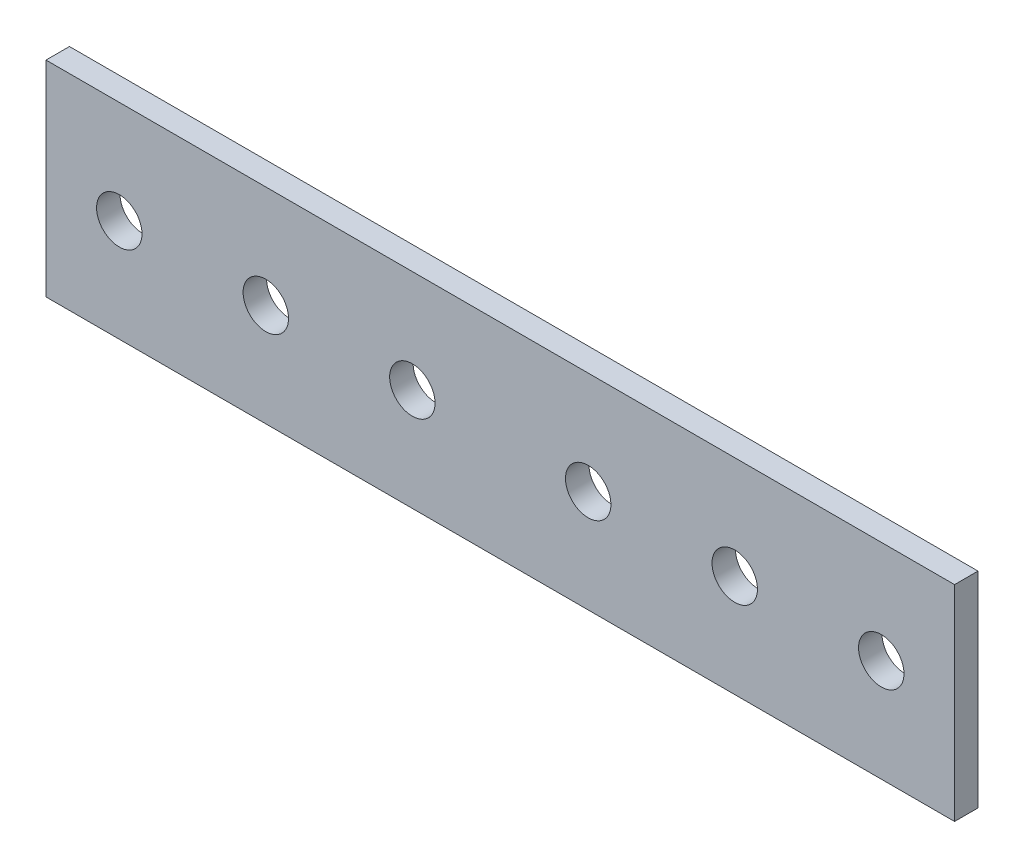
ISO-10303-21;
HEADER;
FILE_DESCRIPTION(('STEP AP214'),'2;1');
FILE_NAME('part.step','',(''),(''),'','','');
FILE_SCHEMA(('AUTOMOTIVE_DESIGN { 1 0 10303 214 1 1 1 1 }'));
ENDSEC;
DATA;
#1=APPLICATION_CONTEXT('core data for automotive mechanical design processes');
#2=APPLICATION_PROTOCOL_DEFINITION('international standard','automotive_design',2000,#1);
#3=PRODUCT_CONTEXT('',#1,'mechanical');
#4=PRODUCT('Part','Part','',(#3));
#5=PRODUCT_RELATED_PRODUCT_CATEGORY('part','',(#4));
#6=PRODUCT_DEFINITION_FORMATION('','',#4);
#7=PRODUCT_DEFINITION_CONTEXT('part definition',#1,'design');
#8=PRODUCT_DEFINITION('design','',#6,#7);
#9=PRODUCT_DEFINITION_SHAPE('','',#8);
#10=(LENGTH_UNIT() NAMED_UNIT(*) SI_UNIT(.MILLI.,.METRE.));
#11=(NAMED_UNIT(*) PLANE_ANGLE_UNIT() SI_UNIT($,.RADIAN.));
#12=(NAMED_UNIT(*) SI_UNIT($,.STERADIAN.) SOLID_ANGLE_UNIT());
#13=UNCERTAINTY_MEASURE_WITH_UNIT(LENGTH_MEASURE(1.E-05),#10,'distance_accuracy_value','');
#14=(GEOMETRIC_REPRESENTATION_CONTEXT(3) GLOBAL_UNCERTAINTY_ASSIGNED_CONTEXT((#13)) GLOBAL_UNIT_ASSIGNED_CONTEXT((#10,
#11,#12)) REPRESENTATION_CONTEXT('',''));
#15=CARTESIAN_POINT('',(0.,0.,0.));
#16=DIRECTION('',(0.,0.,1.));
#17=DIRECTION('',(1.,0.,0.));
#18=AXIS2_PLACEMENT_3D('',#15,#16,#17);
#19=CARTESIAN_POINT('',(-44.9092942055939,-15.9781588447653,16.));
#20=DIRECTION('',(0.,0.,1.));
#21=DIRECTION('',(1.,0.,0.));
#22=AXIS2_PLACEMENT_3D('',#19,#20,#21);
#23=PLANE('',#22);
#24=CARTESIAN_POINT('',(325.090705794406,54.0218411552347,16.));
#25=DIRECTION('',(0.,0.,1.));
#26=DIRECTION('',(-1.,0.,0.));
#27=AXIS2_PLACEMENT_3D('',#24,#25,#26);
#28=CIRCLE('',#27,15.5);
#29=CARTESIAN_POINT('',(309.590705794406,54.0218411552347,16.));
#30=VERTEX_POINT('',#29);
#31=EDGE_CURVE('E130',#30,#30,#28,.T.);
#32=ORIENTED_EDGE('',*,*,#31,.F.);
#33=EDGE_LOOP('',(#32));
#34=FACE_BOUND('',#33,.T.);
#35=CARTESIAN_POINT('',(105.090705794406,54.0218411552347,16.));
#36=DIRECTION('',(0.,0.,1.));
#37=DIRECTION('',(1.,0.,0.));
#38=AXIS2_PLACEMENT_3D('',#35,#36,#37);
#39=CIRCLE('',#38,15.5);
#40=CARTESIAN_POINT('',(120.590705794406,54.0218411552347,16.));
#41=VERTEX_POINT('',#40);
#42=EDGE_CURVE('E118',#41,#41,#39,.T.);
#43=ORIENTED_EDGE('',*,*,#42,.F.);
#44=EDGE_LOOP('',(#43));
#45=FACE_BOUND('',#44,.T.);
#46=CARTESIAN_POINT('',(5.09070579440612,54.0218411552347,16.));
#47=DIRECTION('',(0.,0.,1.));
#48=DIRECTION('',(1.,0.,0.));
#49=AXIS2_PLACEMENT_3D('',#46,#47,#48);
#50=CIRCLE('',#49,15.5);
#51=CARTESIAN_POINT('',(20.5907057944061,54.0218411552347,16.));
#52=VERTEX_POINT('',#51);
#53=EDGE_CURVE('E97',#52,#52,#50,.T.);
#54=ORIENTED_EDGE('',*,*,#53,.F.);
#55=EDGE_LOOP('',(#54));
#56=FACE_BOUND('',#55,.T.);
#57=DIRECTION('',(0.,-1.,0.));
#58=VECTOR('',#57,1.);
#59=CARTESIAN_POINT('',(-44.9092942055939,124.021841155235,16.));
#60=LINE('',#59,#58);
#61=CARTESIAN_POINT('',(-44.9092942055939,124.021841155235,16.));
#62=VERTEX_POINT('',#61);
#63=CARTESIAN_POINT('',(-44.9092942055939,-15.9781588447653,16.));
#64=VERTEX_POINT('',#63);
#65=EDGE_CURVE('E82',#62,#64,#60,.T.);
#66=ORIENTED_EDGE('',*,*,#65,.T.);
#67=DIRECTION('',(1.,0.,0.));
#68=VECTOR('',#67,1.);
#69=CARTESIAN_POINT('',(-44.9092942055939,-15.9781588447653,16.));
#70=LINE('',#69,#68);
#71=CARTESIAN_POINT('',(575.090705794406,-15.9781588447653,16.));
#72=VERTEX_POINT('',#71);
#73=EDGE_CURVE('E77',#64,#72,#70,.T.);
#74=ORIENTED_EDGE('',*,*,#73,.T.);
#75=DIRECTION('',(0.,1.,0.));
#76=VECTOR('',#75,1.);
#77=CARTESIAN_POINT('',(575.090705794406,124.021841155235,16.));
#78=LINE('',#77,#76);
#79=CARTESIAN_POINT('',(575.090705794406,124.021841155235,16.));
#80=VERTEX_POINT('',#79);
#81=EDGE_CURVE('E80',#72,#80,#78,.T.);
#82=ORIENTED_EDGE('',*,*,#81,.T.);
#83=DIRECTION('',(-1.,0.,0.));
#84=VECTOR('',#83,1.);
#85=CARTESIAN_POINT('',(-44.9092942055939,124.021841155235,16.));
#86=LINE('',#85,#84);
#87=EDGE_CURVE('E47',#80,#62,#86,.T.);
#88=ORIENTED_EDGE('',*,*,#87,.T.);
#89=EDGE_LOOP('',(#66,#74,#82,#88));
#90=FACE_BOUND('',#89,.T.);
#91=CARTESIAN_POINT('',(205.090705794406,54.0218411552347,16.));
#92=DIRECTION('',(0.,0.,1.));
#93=DIRECTION('',(1.,0.,0.));
#94=AXIS2_PLACEMENT_3D('',#91,#92,#93);
#95=CIRCLE('',#94,15.5);
#96=CARTESIAN_POINT('',(220.590705794406,54.0218411552347,16.));
#97=VERTEX_POINT('',#96);
#98=EDGE_CURVE('E112',#97,#97,#95,.T.);
#99=ORIENTED_EDGE('',*,*,#98,.F.);
#100=EDGE_LOOP('',(#99));
#101=FACE_BOUND('',#100,.T.);
#102=CARTESIAN_POINT('',(425.090705794406,54.0218411552347,16.));
#103=DIRECTION('',(0.,0.,1.));
#104=DIRECTION('',(-1.,0.,0.));
#105=AXIS2_PLACEMENT_3D('',#102,#103,#104);
#106=CIRCLE('',#105,15.5);
#107=CARTESIAN_POINT('',(409.590705794406,54.0218411552347,16.));
#108=VERTEX_POINT('',#107);
#109=EDGE_CURVE('E124',#108,#108,#106,.T.);
#110=ORIENTED_EDGE('',*,*,#109,.F.);
#111=EDGE_LOOP('',(#110));
#112=FACE_BOUND('',#111,.T.);
#113=CARTESIAN_POINT('',(525.090705794406,54.0218411552347,16.));
#114=DIRECTION('',(0.,0.,1.));
#115=DIRECTION('',(-1.,0.,0.));
#116=AXIS2_PLACEMENT_3D('',#113,#114,#115);
#117=CIRCLE('',#116,15.4999999999999);
#118=CARTESIAN_POINT('',(509.590705794406,54.0218411552347,16.));
#119=VERTEX_POINT('',#118);
#120=EDGE_CURVE('E136',#119,#119,#117,.T.);
#121=ORIENTED_EDGE('',*,*,#120,.F.);
#122=EDGE_LOOP('',(#121));
#123=FACE_BOUND('',#122,.T.);
#124=ADVANCED_FACE('F30',(#34,#45,#56,#90,#101,#112,#123),#23,.T.);
#125=CARTESIAN_POINT('',(-44.9092942055939,-15.9781588447653,0.));
#126=DIRECTION('',(0.,0.,1.));
#127=DIRECTION('',(1.,0.,0.));
#128=AXIS2_PLACEMENT_3D('',#125,#126,#127);
#129=PLANE('',#128);
#130=CARTESIAN_POINT('',(325.090705794406,54.0218411552347,0.));
#131=DIRECTION('',(0.,0.,1.));
#132=DIRECTION('',(-1.,0.,0.));
#133=AXIS2_PLACEMENT_3D('',#130,#131,#132);
#134=CIRCLE('',#133,15.5);
#135=CARTESIAN_POINT('',(309.590705794406,54.0218411552347,0.));
#136=VERTEX_POINT('',#135);
#137=EDGE_CURVE('E133',#136,#136,#134,.T.);
#138=ORIENTED_EDGE('',*,*,#137,.T.);
#139=EDGE_LOOP('',(#138));
#140=FACE_BOUND('',#139,.T.);
#141=CARTESIAN_POINT('',(105.090705794406,54.0218411552347,0.));
#142=DIRECTION('',(0.,0.,1.));
#143=DIRECTION('',(1.,0.,0.));
#144=AXIS2_PLACEMENT_3D('',#141,#142,#143);
#145=CIRCLE('',#144,15.5);
#146=CARTESIAN_POINT('',(120.590705794406,54.0218411552347,0.));
#147=VERTEX_POINT('',#146);
#148=EDGE_CURVE('E121',#147,#147,#145,.T.);
#149=ORIENTED_EDGE('',*,*,#148,.T.);
#150=EDGE_LOOP('',(#149));
#151=FACE_BOUND('',#150,.T.);
#152=CARTESIAN_POINT('',(5.09070579440612,54.0218411552347,0.));
#153=DIRECTION('',(0.,0.,1.));
#154=DIRECTION('',(1.,0.,0.));
#155=AXIS2_PLACEMENT_3D('',#152,#153,#154);
#156=CIRCLE('',#155,15.5);
#157=CARTESIAN_POINT('',(20.5907057944061,54.0218411552347,0.));
#158=VERTEX_POINT('',#157);
#159=EDGE_CURVE('E109',#158,#158,#156,.T.);
#160=ORIENTED_EDGE('',*,*,#159,.T.);
#161=EDGE_LOOP('',(#160));
#162=FACE_BOUND('',#161,.T.);
#163=DIRECTION('',(0.,-1.,0.));
#164=VECTOR('',#163,1.);
#165=CARTESIAN_POINT('',(-44.9092942055939,124.021841155235,0.));
#166=LINE('',#165,#164);
#167=CARTESIAN_POINT('',(-44.9092942055939,124.021841155235,0.));
#168=VERTEX_POINT('',#167);
#169=CARTESIAN_POINT('',(-44.9092942055939,-15.9781588447653,0.));
#170=VERTEX_POINT('',#169);
#171=EDGE_CURVE('E94',#168,#170,#166,.T.);
#172=ORIENTED_EDGE('',*,*,#171,.F.);
#173=DIRECTION('',(-1.,0.,0.));
#174=VECTOR('',#173,1.);
#175=CARTESIAN_POINT('',(-44.9092942055939,124.021841155235,0.));
#176=LINE('',#175,#174);
#177=CARTESIAN_POINT('',(575.090705794406,124.021841155235,0.));
#178=VERTEX_POINT('',#177);
#179=EDGE_CURVE('E70',#178,#168,#176,.T.);
#180=ORIENTED_EDGE('',*,*,#179,.F.);
#181=DIRECTION('',(0.,1.,0.));
#182=VECTOR('',#181,1.);
#183=CARTESIAN_POINT('',(575.090705794406,124.021841155235,0.));
#184=LINE('',#183,#182);
#185=CARTESIAN_POINT('',(575.090705794406,-15.9781588447653,0.));
#186=VERTEX_POINT('',#185);
#187=EDGE_CURVE('E64',#186,#178,#184,.T.);
#188=ORIENTED_EDGE('',*,*,#187,.F.);
#189=DIRECTION('',(1.,0.,0.));
#190=VECTOR('',#189,1.);
#191=CARTESIAN_POINT('',(-44.9092942055939,-15.9781588447653,0.));
#192=LINE('',#191,#190);
#193=EDGE_CURVE('E86',#170,#186,#192,.T.);
#194=ORIENTED_EDGE('',*,*,#193,.F.);
#195=EDGE_LOOP('',(#172,#180,#188,#194));
#196=FACE_BOUND('',#195,.T.);
#197=CARTESIAN_POINT('',(205.090705794406,54.0218411552347,0.));
#198=DIRECTION('',(0.,0.,1.));
#199=DIRECTION('',(1.,0.,0.));
#200=AXIS2_PLACEMENT_3D('',#197,#198,#199);
#201=CIRCLE('',#200,15.5);
#202=CARTESIAN_POINT('',(220.590705794406,54.0218411552347,0.));
#203=VERTEX_POINT('',#202);
#204=EDGE_CURVE('E115',#203,#203,#201,.T.);
#205=ORIENTED_EDGE('',*,*,#204,.T.);
#206=EDGE_LOOP('',(#205));
#207=FACE_BOUND('',#206,.T.);
#208=CARTESIAN_POINT('',(425.090705794406,54.0218411552347,0.));
#209=DIRECTION('',(0.,0.,1.));
#210=DIRECTION('',(-1.,0.,0.));
#211=AXIS2_PLACEMENT_3D('',#208,#209,#210);
#212=CIRCLE('',#211,15.5);
#213=CARTESIAN_POINT('',(409.590705794406,54.0218411552347,0.));
#214=VERTEX_POINT('',#213);
#215=EDGE_CURVE('E127',#214,#214,#212,.T.);
#216=ORIENTED_EDGE('',*,*,#215,.T.);
#217=EDGE_LOOP('',(#216));
#218=FACE_BOUND('',#217,.T.);
#219=CARTESIAN_POINT('',(525.090705794406,54.0218411552347,0.));
#220=DIRECTION('',(0.,0.,1.));
#221=DIRECTION('',(-1.,0.,0.));
#222=AXIS2_PLACEMENT_3D('',#219,#220,#221);
#223=CIRCLE('',#222,15.4999999999999);
#224=CARTESIAN_POINT('',(509.590705794406,54.0218411552347,0.));
#225=VERTEX_POINT('',#224);
#226=EDGE_CURVE('E139',#225,#225,#223,.T.);
#227=ORIENTED_EDGE('',*,*,#226,.T.);
#228=EDGE_LOOP('',(#227));
#229=FACE_BOUND('',#228,.T.);
#230=ADVANCED_FACE('F105',(#140,#151,#162,#196,#207,#218,#229),#129,.F.);
#231=CARTESIAN_POINT('',(-44.9092942055939,124.021841155235,16.));
#232=DIRECTION('',(1.,0.,0.));
#233=DIRECTION('',(0.,1.,0.));
#234=AXIS2_PLACEMENT_3D('',#231,#232,#233);
#235=PLANE('',#234);
#236=ORIENTED_EDGE('',*,*,#171,.T.);
#237=DIRECTION('',(0.,0.,-1.));
#238=VECTOR('',#237,1.);
#239=CARTESIAN_POINT('',(-44.9092942055939,-15.9781588447653,16.));
#240=LINE('',#239,#238);
#241=EDGE_CURVE('E11',#64,#170,#240,.T.);
#242=ORIENTED_EDGE('',*,*,#241,.F.);
#243=ORIENTED_EDGE('',*,*,#65,.F.);
#244=DIRECTION('',(0.,0.,-1.));
#245=VECTOR('',#244,1.);
#246=CARTESIAN_POINT('',(-44.9092942055939,124.021841155235,16.));
#247=LINE('',#246,#245);
#248=EDGE_CURVE('E90',#62,#168,#247,.T.);
#249=ORIENTED_EDGE('',*,*,#248,.T.);
#250=EDGE_LOOP('',(#236,#242,#243,#249));
#251=FACE_BOUND('',#250,.T.);
#252=ADVANCED_FACE('F32',(#251),#235,.F.);
#253=CARTESIAN_POINT('',(-44.9092942055939,-15.9781588447653,16.));
#254=DIRECTION('',(0.,1.,0.));
#255=DIRECTION('',(0.,0.,1.));
#256=AXIS2_PLACEMENT_3D('',#253,#254,#255);
#257=PLANE('',#256);
#258=ORIENTED_EDGE('',*,*,#193,.T.);
#259=DIRECTION('',(0.,0.,-1.));
#260=VECTOR('',#259,1.);
#261=CARTESIAN_POINT('',(575.090705794406,-15.9781588447653,16.));
#262=LINE('',#261,#260);
#263=EDGE_CURVE('E39',#72,#186,#262,.T.);
#264=ORIENTED_EDGE('',*,*,#263,.F.);
#265=ORIENTED_EDGE('',*,*,#73,.F.);
#266=ORIENTED_EDGE('',*,*,#241,.T.);
#267=EDGE_LOOP('',(#258,#264,#265,#266));
#268=FACE_BOUND('',#267,.T.);
#269=ADVANCED_FACE('F85',(#268),#257,.F.);
#270=CARTESIAN_POINT('',(575.090705794406,124.021841155235,16.));
#271=DIRECTION('',(-1.,0.,0.));
#272=DIRECTION('',(0.,0.,1.));
#273=AXIS2_PLACEMENT_3D('',#270,#271,#272);
#274=PLANE('',#273);
#275=ORIENTED_EDGE('',*,*,#187,.T.);
#276=DIRECTION('',(0.,0.,-1.));
#277=VECTOR('',#276,1.);
#278=CARTESIAN_POINT('',(575.090705794406,124.021841155235,16.));
#279=LINE('',#278,#277);
#280=EDGE_CURVE('E87',#80,#178,#279,.T.);
#281=ORIENTED_EDGE('',*,*,#280,.F.);
#282=ORIENTED_EDGE('',*,*,#81,.F.);
#283=ORIENTED_EDGE('',*,*,#263,.T.);
#284=EDGE_LOOP('',(#275,#281,#282,#283));
#285=FACE_BOUND('',#284,.T.);
#286=ADVANCED_FACE('F88',(#285),#274,.F.);
#287=CARTESIAN_POINT('',(-44.9092942055939,124.021841155235,16.));
#288=DIRECTION('',(0.,-1.,0.));
#289=DIRECTION('',(0.,0.,-1.));
#290=AXIS2_PLACEMENT_3D('',#287,#288,#289);
#291=PLANE('',#290);
#292=ORIENTED_EDGE('',*,*,#179,.T.);
#293=ORIENTED_EDGE('',*,*,#248,.F.);
#294=ORIENTED_EDGE('',*,*,#87,.F.);
#295=ORIENTED_EDGE('',*,*,#280,.T.);
#296=EDGE_LOOP('',(#292,#293,#294,#295));
#297=FACE_BOUND('',#296,.T.);
#298=ADVANCED_FACE('F102',(#297),#291,.F.);
#299=CARTESIAN_POINT('',(5.09070579440612,54.0218411552347,16.));
#300=DIRECTION('',(0.,0.,-1.));
#301=DIRECTION('',(-1.,0.,0.));
#302=AXIS2_PLACEMENT_3D('',#299,#300,#301);
#303=CYLINDRICAL_SURFACE('',#302,15.5);
#304=ORIENTED_EDGE('',*,*,#53,.T.);
#305=EDGE_LOOP('',(#304));
#306=FACE_BOUND('',#305,.T.);
#307=ORIENTED_EDGE('',*,*,#159,.F.);
#308=EDGE_LOOP('',(#307));
#309=FACE_BOUND('',#308,.T.);
#310=ADVANCED_FACE('F159',(#306,#309),#303,.F.);
#311=CARTESIAN_POINT('',(205.090705794406,54.0218411552347,16.));
#312=DIRECTION('',(0.,0.,-1.));
#313=DIRECTION('',(-1.,0.,0.));
#314=AXIS2_PLACEMENT_3D('',#311,#312,#313);
#315=CYLINDRICAL_SURFACE('',#314,15.5);
#316=ORIENTED_EDGE('',*,*,#98,.T.);
#317=EDGE_LOOP('',(#316));
#318=FACE_BOUND('',#317,.T.);
#319=ORIENTED_EDGE('',*,*,#204,.F.);
#320=EDGE_LOOP('',(#319));
#321=FACE_BOUND('',#320,.T.);
#322=ADVANCED_FACE('F205',(#318,#321),#315,.F.);
#323=CARTESIAN_POINT('',(105.090705794406,54.0218411552347,16.));
#324=DIRECTION('',(0.,0.,-1.));
#325=DIRECTION('',(-1.,0.,0.));
#326=AXIS2_PLACEMENT_3D('',#323,#324,#325);
#327=CYLINDRICAL_SURFACE('',#326,15.5);
#328=ORIENTED_EDGE('',*,*,#42,.T.);
#329=EDGE_LOOP('',(#328));
#330=FACE_BOUND('',#329,.T.);
#331=ORIENTED_EDGE('',*,*,#148,.F.);
#332=EDGE_LOOP('',(#331));
#333=FACE_BOUND('',#332,.T.);
#334=ADVANCED_FACE('F213',(#330,#333),#327,.F.);
#335=CARTESIAN_POINT('',(425.090705794406,54.0218411552347,16.));
#336=DIRECTION('',(0.,0.,-1.));
#337=DIRECTION('',(-1.,0.,0.));
#338=AXIS2_PLACEMENT_3D('',#335,#336,#337);
#339=CYLINDRICAL_SURFACE('',#338,15.5);
#340=ORIENTED_EDGE('',*,*,#109,.T.);
#341=EDGE_LOOP('',(#340));
#342=FACE_BOUND('',#341,.T.);
#343=ORIENTED_EDGE('',*,*,#215,.F.);
#344=EDGE_LOOP('',(#343));
#345=FACE_BOUND('',#344,.T.);
#346=ADVANCED_FACE('F221',(#342,#345),#339,.F.);
#347=CARTESIAN_POINT('',(325.090705794406,54.0218411552347,16.));
#348=DIRECTION('',(0.,0.,-1.));
#349=DIRECTION('',(-1.,0.,0.));
#350=AXIS2_PLACEMENT_3D('',#347,#348,#349);
#351=CYLINDRICAL_SURFACE('',#350,15.5);
#352=ORIENTED_EDGE('',*,*,#31,.T.);
#353=EDGE_LOOP('',(#352));
#354=FACE_BOUND('',#353,.T.);
#355=ORIENTED_EDGE('',*,*,#137,.F.);
#356=EDGE_LOOP('',(#355));
#357=FACE_BOUND('',#356,.T.);
#358=ADVANCED_FACE('F230',(#354,#357),#351,.F.);
#359=CARTESIAN_POINT('',(525.090705794406,54.0218411552347,16.));
#360=DIRECTION('',(0.,0.,-1.));
#361=DIRECTION('',(-1.,0.,0.));
#362=AXIS2_PLACEMENT_3D('',#359,#360,#361);
#363=CYLINDRICAL_SURFACE('',#362,15.4999999999999);
#364=ORIENTED_EDGE('',*,*,#120,.T.);
#365=EDGE_LOOP('',(#364));
#366=FACE_BOUND('',#365,.T.);
#367=ORIENTED_EDGE('',*,*,#226,.F.);
#368=EDGE_LOOP('',(#367));
#369=FACE_BOUND('',#368,.T.);
#370=ADVANCED_FACE('F145',(#366,#369),#363,.F.);
#371=CLOSED_SHELL('',(#124,#230,#252,#269,#286,#298,#310,#322,#334,#346,#358,#370));
#372=MANIFOLD_SOLID_BREP('B2',#371);
#373=ADVANCED_BREP_SHAPE_REPRESENTATION('',(#18,#372),#14);
#374=SHAPE_DEFINITION_REPRESENTATION(#9,#373);
ENDSEC;
END-ISO-10303-21;
